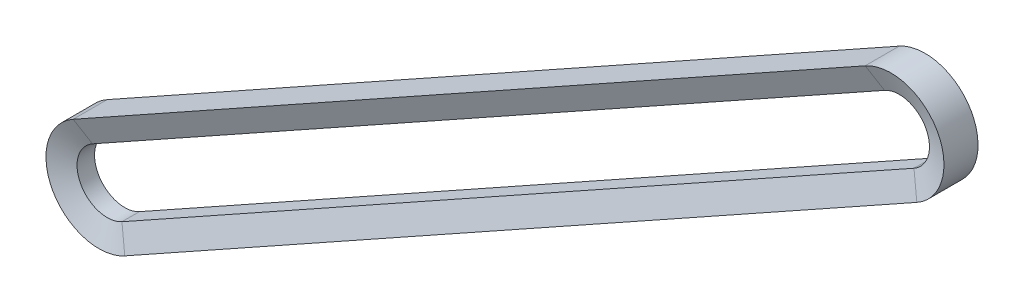
ISO-10303-21;
HEADER;
FILE_DESCRIPTION(('STEP AP214'),'2;1');
FILE_NAME('part.step','',(''),(''),'','','');
FILE_SCHEMA(('AUTOMOTIVE_DESIGN { 1 0 10303 214 1 1 1 1 }'));
ENDSEC;
DATA;
#1=APPLICATION_CONTEXT('core data for automotive mechanical design processes');
#2=APPLICATION_PROTOCOL_DEFINITION('international standard','automotive_design',2000,#1);
#3=PRODUCT_CONTEXT('',#1,'mechanical');
#4=PRODUCT('Part','Part','',(#3));
#5=PRODUCT_RELATED_PRODUCT_CATEGORY('part','',(#4));
#6=PRODUCT_DEFINITION_FORMATION('','',#4);
#7=PRODUCT_DEFINITION_CONTEXT('part definition',#1,'design');
#8=PRODUCT_DEFINITION('design','',#6,#7);
#9=PRODUCT_DEFINITION_SHAPE('','',#8);
#10=(LENGTH_UNIT() NAMED_UNIT(*) SI_UNIT(.MILLI.,.METRE.));
#11=(NAMED_UNIT(*) PLANE_ANGLE_UNIT() SI_UNIT($,.RADIAN.));
#12=(NAMED_UNIT(*) SI_UNIT($,.STERADIAN.) SOLID_ANGLE_UNIT());
#13=UNCERTAINTY_MEASURE_WITH_UNIT(LENGTH_MEASURE(1.E-05),#10,'distance_accuracy_value','');
#14=(GEOMETRIC_REPRESENTATION_CONTEXT(3) GLOBAL_UNCERTAINTY_ASSIGNED_CONTEXT((#13)) GLOBAL_UNIT_ASSIGNED_CONTEXT((#10,
#11,#12)) REPRESENTATION_CONTEXT('',''));
#15=CARTESIAN_POINT('',(0.,0.,0.));
#16=DIRECTION('',(0.,0.,1.));
#17=DIRECTION('',(1.,0.,0.));
#18=AXIS2_PLACEMENT_3D('',#15,#16,#17);
#19=CARTESIAN_POINT('',(-141.653131731597,-73.0403283411197,1.535));
#20=DIRECTION('',(0.48759475960866,-0.873070071874058,0.));
#21=DIRECTION('',(0.873070071874058,0.48759475960866,0.));
#22=AXIS2_PLACEMENT_3D('',#19,#20,#21);
#23=PLANE('',#22);
#24=DIRECTION('',(0.873070071874058,0.48759475960866,0.));
#25=VECTOR('',#24,1.);
#26=CARTESIAN_POINT('',(-141.653131731597,-73.0403283411197,1.535));
#27=LINE('',#26,#25);
#28=CARTESIAN_POINT('',(-141.653131731597,-73.0403283411197,1.535));
#29=VERTEX_POINT('',#28);
#30=CARTESIAN_POINT('',(-2.58425222592396,4.62727138092833,1.535));
#31=VERTEX_POINT('',#30);
#32=EDGE_CURVE('E11',#29,#31,#27,.T.);
#33=ORIENTED_EDGE('',*,*,#32,.F.);
#34=DIRECTION('',(0.,0.,-1.));
#35=VECTOR('',#34,1.);
#36=CARTESIAN_POINT('',(-141.653131731597,-73.0403283411197,1.535));
#37=LINE('',#36,#35);
#38=CARTESIAN_POINT('',(-141.653131731597,-73.0403283411197,-1.535));
#39=VERTEX_POINT('',#38);
#40=EDGE_CURVE('E42',#29,#39,#37,.T.);
#41=ORIENTED_EDGE('',*,*,#40,.T.);
#42=DIRECTION('',(0.873070071874058,0.48759475960866,0.));
#43=VECTOR('',#42,1.);
#44=CARTESIAN_POINT('',(-141.653131731597,-73.0403283411197,-1.535));
#45=LINE('',#44,#43);
#46=CARTESIAN_POINT('',(-2.58425222592396,4.62727138092833,-1.535));
#47=VERTEX_POINT('',#46);
#48=EDGE_CURVE('E127',#39,#47,#45,.T.);
#49=ORIENTED_EDGE('',*,*,#48,.T.);
#50=DIRECTION('',(0.,0.,-1.));
#51=VECTOR('',#50,1.);
#52=CARTESIAN_POINT('',(-2.58425222592396,4.62727138092833,1.535));
#53=LINE('',#52,#51);
#54=EDGE_CURVE('E130',#31,#47,#53,.T.);
#55=ORIENTED_EDGE('',*,*,#54,.F.);
#56=EDGE_LOOP('',(#33,#41,#49,#55));
#57=FACE_BOUND('',#56,.T.);
#58=ADVANCED_FACE('F39',(#57),#23,.T.);
#59=CARTESIAN_POINT('',(-141.653131731597,-73.0403283411197,1.535));
#60=DIRECTION('',(0.166767229566197,-0.298607551115715,0.93969262078591));
#61=DIRECTION('',(0.,-0.953038694783057,-0.302848553317013));
#62=AXIS2_PLACEMENT_3D('',#59,#60,#61);
#63=PLANE('',#62);
#64=DIRECTION('',(0.873070071874058,0.48759475960866,0.));
#65=VECTOR('',#64,1.);
#66=CARTESIAN_POINT('',(-143.603510770032,-69.5480480536236,2.9908809370648));
#67=LINE('',#66,#65);
#68=CARTESIAN_POINT('',(-143.603510770032,-69.5480480536236,2.9908809370648));
#69=VERTEX_POINT('',#68);
#70=CARTESIAN_POINT('',(-4.53463126435882,8.11955166842444,2.9908809370648));
#71=VERTEX_POINT('',#70);
#72=EDGE_CURVE('E47',#69,#71,#67,.T.);
#73=ORIENTED_EDGE('',*,*,#72,.F.);
#74=DIRECTION('',(-0.45818919753819,0.820417503969047,0.342020143325666));
#75=VECTOR('',#74,1.);
#76=CARTESIAN_POINT('',(-141.653131731597,-73.0403283411197,1.535));
#77=LINE('',#76,#75);
#78=EDGE_CURVE('E197',#69,#29,#77,.F.);
#79=ORIENTED_EDGE('',*,*,#78,.T.);
#80=ORIENTED_EDGE('',*,*,#32,.T.);
#81=DIRECTION('',(-0.45818919753819,0.820417503969047,0.342020143325666));
#82=VECTOR('',#81,1.);
#83=CARTESIAN_POINT('',(-2.58425222592396,4.62727138092833,1.535));
#84=LINE('',#83,#82);
#85=EDGE_CURVE('E155',#71,#31,#84,.F.);
#86=ORIENTED_EDGE('',*,*,#85,.F.);
#87=EDGE_LOOP('',(#73,#79,#80,#86));
#88=FACE_BOUND('',#87,.T.);
#89=ADVANCED_FACE('F221',(#88),#63,.T.);
#90=CARTESIAN_POINT('',(-143.603510770032,-69.5480480536236,-2.99088093706479));
#91=DIRECTION('',(-0.48759475960866,0.873070071874058,0.));
#92=DIRECTION('',(-0.873070071874058,-0.48759475960866,0.));
#93=AXIS2_PLACEMENT_3D('',#90,#91,#92);
#94=PLANE('',#93);
#95=DIRECTION('',(0.873070071874058,0.48759475960866,0.));
#96=VECTOR('',#95,1.);
#97=CARTESIAN_POINT('',(-143.603510770032,-69.5480480536236,-2.99088093706479));
#98=LINE('',#97,#96);
#99=CARTESIAN_POINT('',(-143.603510770032,-69.5480480536236,-2.99088093706479));
#100=VERTEX_POINT('',#99);
#101=CARTESIAN_POINT('',(-4.53463126435882,8.11955166842444,-2.99088093706479));
#102=VERTEX_POINT('',#101);
#103=EDGE_CURVE('E136',#100,#102,#98,.T.);
#104=ORIENTED_EDGE('',*,*,#103,.F.);
#105=DIRECTION('',(0.,0.,1.));
#106=VECTOR('',#105,1.);
#107=CARTESIAN_POINT('',(-143.603510770032,-69.5480480536236,-2.99088093706479));
#108=LINE('',#107,#106);
#109=EDGE_CURVE('E181',#100,#69,#108,.T.);
#110=ORIENTED_EDGE('',*,*,#109,.T.);
#111=ORIENTED_EDGE('',*,*,#72,.T.);
#112=DIRECTION('',(0.,0.,1.));
#113=VECTOR('',#112,1.);
#114=CARTESIAN_POINT('',(-4.53463126435882,8.11955166842444,-2.99088093706479));
#115=LINE('',#114,#113);
#116=EDGE_CURVE('E159',#102,#71,#115,.T.);
#117=ORIENTED_EDGE('',*,*,#116,.F.);
#118=EDGE_LOOP('',(#104,#110,#111,#117));
#119=FACE_BOUND('',#118,.T.);
#120=ADVANCED_FACE('F226',(#119),#94,.T.);
#121=CARTESIAN_POINT('',(-139.068879505672,-77.667599722053,0.));
#122=DIRECTION('',(0.,0.,-1.));
#123=DIRECTION('',(-1.,0.,0.));
#124=AXIS2_PLACEMENT_3D('',#121,#122,#123);
#125=CYLINDRICAL_SURFACE('',#124,5.3);
#126=ORIENTED_EDGE('',*,*,#40,.F.);
#127=CARTESIAN_POINT('',(-139.068879505672,-77.667599722053,1.535));
#128=DIRECTION('',(0.,0.,-1.));
#129=DIRECTION('',(0.487594759608419,-0.873070071874192,0.));
#130=AXIS2_PLACEMENT_3D('',#127,#128,#129);
#131=CIRCLE('',#130,5.3);
#132=CARTESIAN_POINT('',(-136.484627279752,-82.2948711029782,1.535));
#133=VERTEX_POINT('',#132);
#134=EDGE_CURVE('E83',#133,#29,#131,.T.);
#135=ORIENTED_EDGE('',*,*,#134,.F.);
#136=DIRECTION('',(0.,0.,-1.));
#137=VECTOR('',#136,1.);
#138=CARTESIAN_POINT('',(-136.484627279747,-82.2948711029862,1.535));
#139=LINE('',#138,#137);
#140=CARTESIAN_POINT('',(-136.484627279752,-82.2948711029782,-1.535));
#141=VERTEX_POINT('',#140);
#142=EDGE_CURVE('E184',#133,#141,#139,.T.);
#143=ORIENTED_EDGE('',*,*,#142,.T.);
#144=CARTESIAN_POINT('',(-139.068879505672,-77.667599722053,-1.535));
#145=DIRECTION('',(0.,0.,-1.));
#146=DIRECTION('',(0.487594759608419,-0.873070071874192,0.));
#147=AXIS2_PLACEMENT_3D('',#144,#145,#146);
#148=CIRCLE('',#147,5.3);
#149=EDGE_CURVE('E179',#141,#39,#148,.T.);
#150=ORIENTED_EDGE('',*,*,#149,.T.);
#151=EDGE_LOOP('',(#126,#135,#143,#150));
#152=FACE_BOUND('',#151,.T.);
#153=ADVANCED_FACE('F210',(#152),#125,.F.);
#154=CARTESIAN_POINT('',(-139.068879505672,-77.667599722053,2.9908809370648));
#155=DIRECTION('',(0.,0.,1.));
#156=DIRECTION('',(1.,0.,0.));
#157=AXIS2_PLACEMENT_3D('',#154,#155,#156);
#158=CONICAL_SURFACE('',#157,9.3,1.22173047639603);
#159=ORIENTED_EDGE('',*,*,#134,.T.);
#160=ORIENTED_EDGE('',*,*,#78,.F.);
#161=CARTESIAN_POINT('',(-139.068879505672,-77.667599722053,2.9908809370648));
#162=DIRECTION('',(0.,0.,-1.));
#163=DIRECTION('',(0.487594759608548,-0.873070071874121,0.));
#164=AXIS2_PLACEMENT_3D('',#161,#162,#163);
#165=CIRCLE('',#164,9.29999999999999);
#166=CARTESIAN_POINT('',(-134.534248241317,-85.7871513904743,2.9908809370648));
#167=VERTEX_POINT('',#166);
#168=EDGE_CURVE('E92',#167,#69,#165,.T.);
#169=ORIENTED_EDGE('',*,*,#168,.F.);
#170=DIRECTION('',(0.45818919753819,-0.820417503969047,0.342020143325666));
#171=VECTOR('',#170,1.);
#172=CARTESIAN_POINT('',(-136.484627279747,-82.2948711029862,1.535));
#173=LINE('',#172,#171);
#174=EDGE_CURVE('E193',#167,#133,#173,.F.);
#175=ORIENTED_EDGE('',*,*,#174,.T.);
#176=EDGE_LOOP('',(#159,#160,#169,#175));
#177=FACE_BOUND('',#176,.T.);
#178=ADVANCED_FACE('F220',(#177),#158,.F.);
#179=CARTESIAN_POINT('',(-139.068879505672,-77.667599722053,0.));
#180=DIRECTION('',(0.,0.,-1.));
#181=DIRECTION('',(-1.,0.,0.));
#182=AXIS2_PLACEMENT_3D('',#179,#180,#181);
#183=CYLINDRICAL_SURFACE('',#182,9.29999999999999);
#184=ORIENTED_EDGE('',*,*,#168,.T.);
#185=ORIENTED_EDGE('',*,*,#109,.F.);
#186=CARTESIAN_POINT('',(-139.068879505672,-77.667599722053,-2.99088093706479));
#187=DIRECTION('',(0.,0.,-1.));
#188=DIRECTION('',(0.487594759608548,-0.873070071874121,0.));
#189=AXIS2_PLACEMENT_3D('',#186,#187,#188);
#190=CIRCLE('',#189,9.29999999999999);
#191=CARTESIAN_POINT('',(-134.534248241317,-85.7871513904743,-2.99088093706479));
#192=VERTEX_POINT('',#191);
#193=EDGE_CURVE('E100',#192,#100,#190,.T.);
#194=ORIENTED_EDGE('',*,*,#193,.F.);
#195=DIRECTION('',(0.,0.,1.));
#196=VECTOR('',#195,1.);
#197=CARTESIAN_POINT('',(-134.534248241313,-85.7871513904823,-2.99088093706479));
#198=LINE('',#197,#196);
#199=EDGE_CURVE('E173',#192,#167,#198,.T.);
#200=ORIENTED_EDGE('',*,*,#199,.T.);
#201=EDGE_LOOP('',(#184,#185,#194,#200));
#202=FACE_BOUND('',#201,.T.);
#203=ADVANCED_FACE('F227',(#202),#183,.T.);
#204=CARTESIAN_POINT('',(-139.068879505672,-77.667599722053,-1.535));
#205=DIRECTION('',(0.,0.,-1.));
#206=DIRECTION('',(-1.,0.,0.));
#207=AXIS2_PLACEMENT_3D('',#204,#205,#206);
#208=CONICAL_SURFACE('',#207,5.3,1.22173047639603);
#209=ORIENTED_EDGE('',*,*,#193,.T.);
#210=DIRECTION('',(-0.45818919753819,0.820417503969047,-0.342020143325665));
#211=VECTOR('',#210,1.);
#212=CARTESIAN_POINT('',(-141.653131731597,-73.0403283411197,-1.535));
#213=LINE('',#212,#211);
#214=EDGE_CURVE('E177',#39,#100,#213,.T.);
#215=ORIENTED_EDGE('',*,*,#214,.F.);
#216=ORIENTED_EDGE('',*,*,#149,.F.);
#217=DIRECTION('',(0.45818919753819,-0.820417503969047,-0.342020143325665));
#218=VECTOR('',#217,1.);
#219=CARTESIAN_POINT('',(-136.484627279747,-82.2948711029862,-1.535));
#220=LINE('',#219,#218);
#221=EDGE_CURVE('E168',#141,#192,#220,.T.);
#222=ORIENTED_EDGE('',*,*,#221,.T.);
#223=EDGE_LOOP('',(#209,#215,#216,#222));
#224=FACE_BOUND('',#223,.T.);
#225=ADVANCED_FACE('F228',(#224),#208,.F.);
#226=CARTESIAN_POINT('',(2.58425222592396,-4.62727138092833,1.535));
#227=DIRECTION('',(-0.48759475960866,0.873070071874058,0.));
#228=DIRECTION('',(-0.873070071874058,-0.48759475960866,0.));
#229=AXIS2_PLACEMENT_3D('',#226,#227,#228);
#230=PLANE('',#229);
#231=ORIENTED_EDGE('',*,*,#142,.F.);
#232=DIRECTION('',(-0.873070071874058,-0.48759475960866,0.));
#233=VECTOR('',#232,1.);
#234=CARTESIAN_POINT('',(2.58425222592396,-4.62727138092833,1.535));
#235=LINE('',#234,#233);
#236=CARTESIAN_POINT('',(2.58425222592843,-4.62727138093634,1.535));
#237=VERTEX_POINT('',#236);
#238=EDGE_CURVE('E203',#237,#133,#235,.T.);
#239=ORIENTED_EDGE('',*,*,#238,.F.);
#240=DIRECTION('',(0.,0.,-1.));
#241=VECTOR('',#240,1.);
#242=CARTESIAN_POINT('',(2.58425222592396,-4.62727138092833,1.535));
#243=LINE('',#242,#241);
#244=CARTESIAN_POINT('',(2.58425222592843,-4.62727138093634,-1.535));
#245=VERTEX_POINT('',#244);
#246=EDGE_CURVE('E176',#237,#245,#243,.T.);
#247=ORIENTED_EDGE('',*,*,#246,.T.);
#248=DIRECTION('',(-0.873070071874058,-0.48759475960866,0.));
#249=VECTOR('',#248,1.);
#250=CARTESIAN_POINT('',(2.58425222592396,-4.62727138092833,-1.535));
#251=LINE('',#250,#249);
#252=EDGE_CURVE('E171',#245,#141,#251,.T.);
#253=ORIENTED_EDGE('',*,*,#252,.T.);
#254=EDGE_LOOP('',(#231,#239,#247,#253));
#255=FACE_BOUND('',#254,.T.);
#256=ADVANCED_FACE('F215',(#255),#230,.T.);
#257=CARTESIAN_POINT('',(2.58425222592396,-4.62727138092833,1.535));
#258=DIRECTION('',(-0.166767229566197,0.298607551115715,0.93969262078591));
#259=DIRECTION('',(0.,-0.953038694783057,0.302848553317013));
#260=AXIS2_PLACEMENT_3D('',#257,#258,#259);
#261=PLANE('',#260);
#262=ORIENTED_EDGE('',*,*,#238,.T.);
#263=ORIENTED_EDGE('',*,*,#174,.F.);
#264=DIRECTION('',(-0.873070071874058,-0.48759475960866,0.));
#265=VECTOR('',#264,1.);
#266=CARTESIAN_POINT('',(4.53463126435882,-8.11955166842444,2.9908809370648));
#267=LINE('',#266,#265);
#268=CARTESIAN_POINT('',(4.5346312643633,-8.11955166843245,2.9908809370648));
#269=VERTEX_POINT('',#268);
#270=EDGE_CURVE('E112',#269,#167,#267,.T.);
#271=ORIENTED_EDGE('',*,*,#270,.F.);
#272=DIRECTION('',(0.45818919753819,-0.820417503969046,0.342020143325666));
#273=VECTOR('',#272,1.);
#274=CARTESIAN_POINT('',(2.58425222592396,-4.62727138092833,1.535));
#275=LINE('',#274,#273);
#276=EDGE_CURVE('E190',#269,#237,#275,.F.);
#277=ORIENTED_EDGE('',*,*,#276,.T.);
#278=EDGE_LOOP('',(#262,#263,#271,#277));
#279=FACE_BOUND('',#278,.T.);
#280=ADVANCED_FACE('F219',(#279),#261,.T.);
#281=CARTESIAN_POINT('',(4.53463126435882,-8.11955166842444,-2.99088093706479));
#282=DIRECTION('',(0.48759475960866,-0.873070071874058,0.));
#283=DIRECTION('',(0.873070071874058,0.48759475960866,0.));
#284=AXIS2_PLACEMENT_3D('',#281,#282,#283);
#285=PLANE('',#284);
#286=ORIENTED_EDGE('',*,*,#270,.T.);
#287=ORIENTED_EDGE('',*,*,#199,.F.);
#288=DIRECTION('',(-0.873070071874058,-0.48759475960866,0.));
#289=VECTOR('',#288,1.);
#290=CARTESIAN_POINT('',(4.53463126435882,-8.11955166842444,-2.99088093706479));
#291=LINE('',#290,#289);
#292=CARTESIAN_POINT('',(4.5346312643633,-8.11955166843245,-2.99088093706479));
#293=VERTEX_POINT('',#292);
#294=EDGE_CURVE('E118',#293,#192,#291,.T.);
#295=ORIENTED_EDGE('',*,*,#294,.F.);
#296=DIRECTION('',(0.,0.,1.));
#297=VECTOR('',#296,1.);
#298=CARTESIAN_POINT('',(4.53463126435883,-8.11955166842444,-2.99088093706479));
#299=LINE('',#298,#297);
#300=EDGE_CURVE('E166',#293,#269,#299,.T.);
#301=ORIENTED_EDGE('',*,*,#300,.T.);
#302=EDGE_LOOP('',(#286,#287,#295,#301));
#303=FACE_BOUND('',#302,.T.);
#304=ADVANCED_FACE('F284',(#303),#285,.T.);
#305=CARTESIAN_POINT('',(2.58425222592396,-4.62727138092833,-1.535));
#306=DIRECTION('',(-0.166767229566197,0.298607551115715,-0.93969262078591));
#307=DIRECTION('',(0.,0.953038694783057,0.302848553317013));
#308=AXIS2_PLACEMENT_3D('',#305,#306,#307);
#309=PLANE('',#308);
#310=ORIENTED_EDGE('',*,*,#294,.T.);
#311=ORIENTED_EDGE('',*,*,#221,.F.);
#312=ORIENTED_EDGE('',*,*,#252,.F.);
#313=DIRECTION('',(0.45818919753819,-0.820417503969046,-0.342020143325665));
#314=VECTOR('',#313,1.);
#315=CARTESIAN_POINT('',(2.58425222592396,-4.62727138092833,-1.535));
#316=LINE('',#315,#314);
#317=EDGE_CURVE('E147',#245,#293,#316,.T.);
#318=ORIENTED_EDGE('',*,*,#317,.T.);
#319=EDGE_LOOP('',(#310,#311,#312,#318));
#320=FACE_BOUND('',#319,.T.);
#321=ADVANCED_FACE('F213',(#320),#309,.T.);
#322=CARTESIAN_POINT('',(6.66133814775094E-13,-4.88498130835069E-12,0.));
#323=DIRECTION('',(0.,0.,-1.));
#324=DIRECTION('',(-1.,0.,0.));
#325=AXIS2_PLACEMENT_3D('',#322,#323,#324);
#326=CYLINDRICAL_SURFACE('',#325,5.3);
#327=ORIENTED_EDGE('',*,*,#246,.F.);
#328=CARTESIAN_POINT('',(6.66133814775094E-13,-4.88498130835069E-12,1.535));
#329=DIRECTION('',(0.,0.,-1.));
#330=DIRECTION('',(-0.48759475960842,0.873070071874192,0.));
#331=AXIS2_PLACEMENT_3D('',#328,#329,#330);
#332=CIRCLE('',#331,5.3);
#333=EDGE_CURVE('E154',#31,#237,#332,.T.);
#334=ORIENTED_EDGE('',*,*,#333,.F.);
#335=ORIENTED_EDGE('',*,*,#54,.T.);
#336=CARTESIAN_POINT('',(6.66133814775094E-13,-4.88498130835069E-12,-1.535));
#337=DIRECTION('',(0.,0.,-1.));
#338=DIRECTION('',(-0.48759475960842,0.873070071874192,0.));
#339=AXIS2_PLACEMENT_3D('',#336,#337,#338);
#340=CIRCLE('',#339,5.3);
#341=EDGE_CURVE('E142',#47,#245,#340,.T.);
#342=ORIENTED_EDGE('',*,*,#341,.T.);
#343=EDGE_LOOP('',(#327,#334,#335,#342));
#344=FACE_BOUND('',#343,.T.);
#345=ADVANCED_FACE('F152',(#344),#326,.F.);
#346=CARTESIAN_POINT('',(6.66133814775094E-13,-4.88498130835069E-12,2.9908809370648));
#347=DIRECTION('',(0.,0.,1.));
#348=DIRECTION('',(1.,0.,0.));
#349=AXIS2_PLACEMENT_3D('',#346,#347,#348);
#350=CONICAL_SURFACE('',#349,9.3,1.22173047639603);
#351=ORIENTED_EDGE('',*,*,#333,.T.);
#352=ORIENTED_EDGE('',*,*,#276,.F.);
#353=CARTESIAN_POINT('',(6.66133814775094E-13,-4.88498130835069E-12,2.9908809370648));
#354=DIRECTION('',(0.,0.,-1.));
#355=DIRECTION('',(-0.487594759608547,0.873070071874121,0.));
#356=AXIS2_PLACEMENT_3D('',#353,#354,#355);
#357=CIRCLE('',#356,9.3);
#358=EDGE_CURVE('E187',#71,#269,#357,.T.);
#359=ORIENTED_EDGE('',*,*,#358,.F.);
#360=ORIENTED_EDGE('',*,*,#85,.T.);
#361=EDGE_LOOP('',(#351,#352,#359,#360));
#362=FACE_BOUND('',#361,.T.);
#363=ADVANCED_FACE('F217',(#362),#350,.F.);
#364=CARTESIAN_POINT('',(6.66133814775094E-13,-4.88498130835069E-12,0.));
#365=DIRECTION('',(0.,0.,-1.));
#366=DIRECTION('',(-1.,0.,0.));
#367=AXIS2_PLACEMENT_3D('',#364,#365,#366);
#368=CYLINDRICAL_SURFACE('',#367,9.3);
#369=ORIENTED_EDGE('',*,*,#358,.T.);
#370=ORIENTED_EDGE('',*,*,#300,.F.);
#371=CARTESIAN_POINT('',(6.66133814775094E-13,-4.88498130835069E-12,-2.99088093706479));
#372=DIRECTION('',(0.,0.,-1.));
#373=DIRECTION('',(-0.487594759608547,0.873070071874121,0.));
#374=AXIS2_PLACEMENT_3D('',#371,#372,#373);
#375=CIRCLE('',#374,9.3);
#376=EDGE_CURVE('E165',#102,#293,#375,.T.);
#377=ORIENTED_EDGE('',*,*,#376,.F.);
#378=ORIENTED_EDGE('',*,*,#116,.T.);
#379=EDGE_LOOP('',(#369,#370,#377,#378));
#380=FACE_BOUND('',#379,.T.);
#381=ADVANCED_FACE('F224',(#380),#368,.T.);
#382=CARTESIAN_POINT('',(6.66133814775094E-13,-4.88498130835069E-12,-1.535));
#383=DIRECTION('',(0.,0.,-1.));
#384=DIRECTION('',(-1.,0.,0.));
#385=AXIS2_PLACEMENT_3D('',#382,#383,#384);
#386=CONICAL_SURFACE('',#385,5.3,1.22173047639603);
#387=ORIENTED_EDGE('',*,*,#376,.T.);
#388=ORIENTED_EDGE('',*,*,#317,.F.);
#389=ORIENTED_EDGE('',*,*,#341,.F.);
#390=DIRECTION('',(-0.45818919753819,0.820417503969047,-0.342020143325665));
#391=VECTOR('',#390,1.);
#392=CARTESIAN_POINT('',(-2.58425222592396,4.62727138092833,-1.535));
#393=LINE('',#392,#391);
#394=EDGE_CURVE('E145',#47,#102,#393,.T.);
#395=ORIENTED_EDGE('',*,*,#394,.T.);
#396=EDGE_LOOP('',(#387,#388,#389,#395));
#397=FACE_BOUND('',#396,.T.);
#398=ADVANCED_FACE('F144',(#397),#386,.F.);
#399=CARTESIAN_POINT('',(-141.653131731597,-73.0403283411197,-1.535));
#400=DIRECTION('',(0.166767229566197,-0.298607551115715,-0.93969262078591));
#401=DIRECTION('',(0.,0.953038694783057,-0.302848553317013));
#402=AXIS2_PLACEMENT_3D('',#399,#400,#401);
#403=PLANE('',#402);
#404=ORIENTED_EDGE('',*,*,#214,.T.);
#405=ORIENTED_EDGE('',*,*,#103,.T.);
#406=ORIENTED_EDGE('',*,*,#394,.F.);
#407=ORIENTED_EDGE('',*,*,#48,.F.);
#408=EDGE_LOOP('',(#404,#405,#406,#407));
#409=FACE_BOUND('',#408,.T.);
#410=ADVANCED_FACE('F157',(#409),#403,.T.);
#411=CLOSED_SHELL('',(#58,#89,#120,#153,#178,#203,#225,#256,#280,#304,#321,#345,#363,#381,#398,#410));
#412=MANIFOLD_SOLID_BREP('B2',#411);
#413=ADVANCED_BREP_SHAPE_REPRESENTATION('',(#18,#412),#14);
#414=SHAPE_DEFINITION_REPRESENTATION(#9,#413);
ENDSEC;
END-ISO-10303-21;
